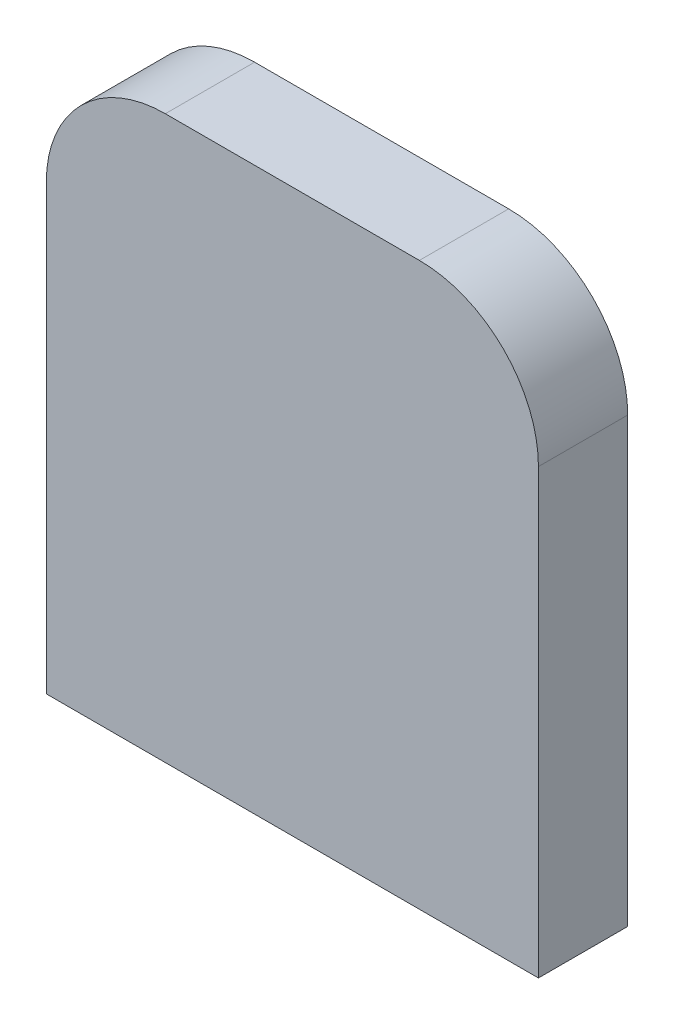
ISO-10303-21;
HEADER;
FILE_DESCRIPTION(('STEP AP214'),'2;1');
FILE_NAME('part.step','',(''),(''),'','','');
FILE_SCHEMA(('AUTOMOTIVE_DESIGN { 1 0 10303 214 1 1 1 1 }'));
ENDSEC;
DATA;
#1=APPLICATION_CONTEXT('core data for automotive mechanical design processes');
#2=APPLICATION_PROTOCOL_DEFINITION('international standard','automotive_design',2000,#1);
#3=PRODUCT_CONTEXT('',#1,'mechanical');
#4=PRODUCT('Part','Part','',(#3));
#5=PRODUCT_RELATED_PRODUCT_CATEGORY('part','',(#4));
#6=PRODUCT_DEFINITION_FORMATION('','',#4);
#7=PRODUCT_DEFINITION_CONTEXT('part definition',#1,'design');
#8=PRODUCT_DEFINITION('design','',#6,#7);
#9=PRODUCT_DEFINITION_SHAPE('','',#8);
#10=(LENGTH_UNIT() NAMED_UNIT(*) SI_UNIT(.MILLI.,.METRE.));
#11=(NAMED_UNIT(*) PLANE_ANGLE_UNIT() SI_UNIT($,.RADIAN.));
#12=(NAMED_UNIT(*) SI_UNIT($,.STERADIAN.) SOLID_ANGLE_UNIT());
#13=UNCERTAINTY_MEASURE_WITH_UNIT(LENGTH_MEASURE(1.E-05),#10,'distance_accuracy_value','');
#14=(GEOMETRIC_REPRESENTATION_CONTEXT(3) GLOBAL_UNCERTAINTY_ASSIGNED_CONTEXT((#13)) GLOBAL_UNIT_ASSIGNED_CONTEXT((#10,
#11,#12)) REPRESENTATION_CONTEXT('',''));
#15=CARTESIAN_POINT('',(0.,0.,0.));
#16=DIRECTION('',(0.,0.,1.));
#17=DIRECTION('',(1.,0.,0.));
#18=AXIS2_PLACEMENT_3D('',#15,#16,#17);
#19=CARTESIAN_POINT('',(12.5367273608581,19.7841127998877,3.));
#20=DIRECTION('',(0.,0.,-1.));
#21=DIRECTION('',(-1.,0.,0.));
#22=AXIS2_PLACEMENT_3D('',#19,#20,#21);
#23=CYLINDRICAL_SURFACE('',#22,4.);
#24=CARTESIAN_POINT('',(12.5367273608581,19.7841127998877,0.));
#25=DIRECTION('',(0.,0.,1.));
#26=DIRECTION('',(-1.,0.,0.));
#27=AXIS2_PLACEMENT_3D('',#24,#25,#26);
#28=CIRCLE('',#27,4.);
#29=CARTESIAN_POINT('',(16.5367273608581,19.7841127998877,0.));
#30=VERTEX_POINT('',#29);
#31=CARTESIAN_POINT('',(12.5367273608581,23.7841127998877,0.));
#32=VERTEX_POINT('',#31);
#33=EDGE_CURVE('E117',#30,#32,#28,.T.);
#34=ORIENTED_EDGE('',*,*,#33,.T.);
#35=DIRECTION('',(0.,0.,-1.));
#36=VECTOR('',#35,1.);
#37=CARTESIAN_POINT('',(12.5367273608581,23.7841127998877,3.));
#38=LINE('',#37,#36);
#39=CARTESIAN_POINT('',(12.5367273608581,23.7841127998877,3.));
#40=VERTEX_POINT('',#39);
#41=EDGE_CURVE('E11',#40,#32,#38,.T.);
#42=ORIENTED_EDGE('',*,*,#41,.F.);
#43=CARTESIAN_POINT('',(12.5367273608581,19.7841127998877,3.));
#44=DIRECTION('',(0.,0.,1.));
#45=DIRECTION('',(-1.,0.,0.));
#46=AXIS2_PLACEMENT_3D('',#43,#44,#45);
#47=CIRCLE('',#46,4.);
#48=CARTESIAN_POINT('',(16.5367273608581,19.7841127998877,3.));
#49=VERTEX_POINT('',#48);
#50=EDGE_CURVE('E127',#49,#40,#47,.T.);
#51=ORIENTED_EDGE('',*,*,#50,.F.);
#52=DIRECTION('',(0.,0.,-1.));
#53=VECTOR('',#52,1.);
#54=CARTESIAN_POINT('',(16.5367273608581,19.7841127998877,3.));
#55=LINE('',#54,#53);
#56=EDGE_CURVE('E113',#49,#30,#55,.T.);
#57=ORIENTED_EDGE('',*,*,#56,.T.);
#58=EDGE_LOOP('',(#34,#42,#51,#57));
#59=FACE_BOUND('',#58,.T.);
#60=ADVANCED_FACE('F33',(#59),#23,.T.);
#61=CARTESIAN_POINT('',(4.00000000000003,23.7841127998877,3.));
#62=DIRECTION('',(0.,-1.,0.));
#63=DIRECTION('',(0.,0.,-1.));
#64=AXIS2_PLACEMENT_3D('',#61,#62,#63);
#65=PLANE('',#64);
#66=DIRECTION('',(-1.,0.,0.));
#67=VECTOR('',#66,1.);
#68=CARTESIAN_POINT('',(4.00000000000003,23.7841127998877,0.));
#69=LINE('',#68,#67);
#70=CARTESIAN_POINT('',(4.00000000000003,23.7841127998877,0.));
#71=VERTEX_POINT('',#70);
#72=EDGE_CURVE('E120',#32,#71,#69,.T.);
#73=ORIENTED_EDGE('',*,*,#72,.T.);
#74=DIRECTION('',(0.,0.,-1.));
#75=VECTOR('',#74,1.);
#76=CARTESIAN_POINT('',(4.00000000000003,23.7841127998877,3.));
#77=LINE('',#76,#75);
#78=CARTESIAN_POINT('',(4.00000000000003,23.7841127998877,3.));
#79=VERTEX_POINT('',#78);
#80=EDGE_CURVE('E41',#79,#71,#77,.T.);
#81=ORIENTED_EDGE('',*,*,#80,.F.);
#82=DIRECTION('',(-1.,0.,0.));
#83=VECTOR('',#82,1.);
#84=CARTESIAN_POINT('',(4.00000000000003,23.7841127998877,3.));
#85=LINE('',#84,#83);
#86=EDGE_CURVE('E86',#40,#79,#85,.T.);
#87=ORIENTED_EDGE('',*,*,#86,.F.);
#88=ORIENTED_EDGE('',*,*,#41,.T.);
#89=EDGE_LOOP('',(#73,#81,#87,#88));
#90=FACE_BOUND('',#89,.T.);
#91=ADVANCED_FACE('F151',(#90),#65,.F.);
#92=CARTESIAN_POINT('',(4.,19.7841127998877,3.));
#93=DIRECTION('',(0.,0.,-1.));
#94=DIRECTION('',(-1.,0.,0.));
#95=AXIS2_PLACEMENT_3D('',#92,#93,#94);
#96=CYLINDRICAL_SURFACE('',#95,4.);
#97=CARTESIAN_POINT('',(4.,19.7841127998877,0.));
#98=DIRECTION('',(0.,0.,1.));
#99=DIRECTION('',(1.,0.,0.));
#100=AXIS2_PLACEMENT_3D('',#97,#98,#99);
#101=CIRCLE('',#100,4.);
#102=CARTESIAN_POINT('',(0.,19.7841127998877,0.));
#103=VERTEX_POINT('',#102);
#104=EDGE_CURVE('E122',#71,#103,#101,.T.);
#105=ORIENTED_EDGE('',*,*,#104,.T.);
#106=DIRECTION('',(0.,0.,-1.));
#107=VECTOR('',#106,1.);
#108=CARTESIAN_POINT('',(0.,19.7841127998877,3.));
#109=LINE('',#108,#107);
#110=CARTESIAN_POINT('',(0.,19.7841127998877,3.));
#111=VERTEX_POINT('',#110);
#112=EDGE_CURVE('E108',#111,#103,#109,.T.);
#113=ORIENTED_EDGE('',*,*,#112,.F.);
#114=CARTESIAN_POINT('',(4.,19.7841127998877,3.));
#115=DIRECTION('',(0.,0.,1.));
#116=DIRECTION('',(1.,0.,0.));
#117=AXIS2_PLACEMENT_3D('',#114,#115,#116);
#118=CIRCLE('',#117,4.);
#119=EDGE_CURVE('E99',#79,#111,#118,.T.);
#120=ORIENTED_EDGE('',*,*,#119,.F.);
#121=ORIENTED_EDGE('',*,*,#80,.T.);
#122=EDGE_LOOP('',(#105,#113,#120,#121));
#123=FACE_BOUND('',#122,.T.);
#124=ADVANCED_FACE('F133',(#123),#96,.T.);
#125=CARTESIAN_POINT('',(1.02348685082632E-13,4.90205487432149,3.));
#126=DIRECTION('',(1.,0.,0.));
#127=DIRECTION('',(0.,1.,0.));
#128=AXIS2_PLACEMENT_3D('',#125,#126,#127);
#129=PLANE('',#128);
#130=DIRECTION('',(0.,-1.,0.));
#131=VECTOR('',#130,1.);
#132=CARTESIAN_POINT('',(1.02348685082632E-13,4.90205487432149,0.));
#133=LINE('',#132,#131);
#134=CARTESIAN_POINT('',(1.02348685082632E-13,4.90205487432149,0.));
#135=VERTEX_POINT('',#134);
#136=EDGE_CURVE('E107',#103,#135,#133,.T.);
#137=ORIENTED_EDGE('',*,*,#136,.T.);
#138=DIRECTION('',(0.,0.,-1.));
#139=VECTOR('',#138,1.);
#140=CARTESIAN_POINT('',(1.02348685082632E-13,4.90205487432149,3.));
#141=LINE('',#140,#139);
#142=CARTESIAN_POINT('',(1.02348685082632E-13,4.90205487432149,3.));
#143=VERTEX_POINT('',#142);
#144=EDGE_CURVE('E104',#143,#135,#141,.T.);
#145=ORIENTED_EDGE('',*,*,#144,.F.);
#146=DIRECTION('',(0.,-1.,0.));
#147=VECTOR('',#146,1.);
#148=CARTESIAN_POINT('',(1.02348685082632E-13,4.90205487432149,3.));
#149=LINE('',#148,#147);
#150=EDGE_CURVE('E93',#111,#143,#149,.T.);
#151=ORIENTED_EDGE('',*,*,#150,.F.);
#152=ORIENTED_EDGE('',*,*,#112,.T.);
#153=EDGE_LOOP('',(#137,#145,#151,#152));
#154=FACE_BOUND('',#153,.T.);
#155=ADVANCED_FACE('F105',(#154),#129,.F.);
#156=CARTESIAN_POINT('',(1.02348685082632E-13,4.90205487432149,3.));
#157=DIRECTION('',(0.,1.,0.));
#158=DIRECTION('',(0.,0.,1.));
#159=AXIS2_PLACEMENT_3D('',#156,#157,#158);
#160=PLANE('',#159);
#161=DIRECTION('',(1.,0.,0.));
#162=VECTOR('',#161,1.);
#163=CARTESIAN_POINT('',(1.02348685082632E-13,4.90205487432149,0.));
#164=LINE('',#163,#162);
#165=CARTESIAN_POINT('',(16.536727360858,4.90205487432149,0.));
#166=VERTEX_POINT('',#165);
#167=EDGE_CURVE('E72',#135,#166,#164,.T.);
#168=ORIENTED_EDGE('',*,*,#167,.T.);
#169=DIRECTION('',(0.,0.,-1.));
#170=VECTOR('',#169,1.);
#171=CARTESIAN_POINT('',(16.536727360858,4.90205487432149,3.));
#172=LINE('',#171,#170);
#173=CARTESIAN_POINT('',(16.536727360858,4.90205487432149,3.));
#174=VERTEX_POINT('',#173);
#175=EDGE_CURVE('E109',#174,#166,#172,.T.);
#176=ORIENTED_EDGE('',*,*,#175,.F.);
#177=DIRECTION('',(1.,0.,0.));
#178=VECTOR('',#177,1.);
#179=CARTESIAN_POINT('',(1.02348685082632E-13,4.90205487432149,3.));
#180=LINE('',#179,#178);
#181=EDGE_CURVE('E97',#143,#174,#180,.T.);
#182=ORIENTED_EDGE('',*,*,#181,.F.);
#183=ORIENTED_EDGE('',*,*,#144,.T.);
#184=EDGE_LOOP('',(#168,#176,#182,#183));
#185=FACE_BOUND('',#184,.T.);
#186=ADVANCED_FACE('F111',(#185),#160,.F.);
#187=CARTESIAN_POINT('',(16.536727360858,4.90205487432149,3.));
#188=DIRECTION('',(-1.,0.,0.));
#189=DIRECTION('',(0.,-1.,0.));
#190=AXIS2_PLACEMENT_3D('',#187,#188,#189);
#191=PLANE('',#190);
#192=DIRECTION('',(0.,1.,0.));
#193=VECTOR('',#192,1.);
#194=CARTESIAN_POINT('',(16.536727360858,4.90205487432149,0.));
#195=LINE('',#194,#193);
#196=EDGE_CURVE('E78',#166,#30,#195,.T.);
#197=ORIENTED_EDGE('',*,*,#196,.T.);
#198=ORIENTED_EDGE('',*,*,#56,.F.);
#199=DIRECTION('',(0.,1.,0.));
#200=VECTOR('',#199,1.);
#201=CARTESIAN_POINT('',(16.536727360858,4.90205487432149,3.));
#202=LINE('',#201,#200);
#203=EDGE_CURVE('E49',#174,#49,#202,.T.);
#204=ORIENTED_EDGE('',*,*,#203,.F.);
#205=ORIENTED_EDGE('',*,*,#175,.T.);
#206=EDGE_LOOP('',(#197,#198,#204,#205));
#207=FACE_BOUND('',#206,.T.);
#208=ADVANCED_FACE('F140',(#207),#191,.F.);
#209=CARTESIAN_POINT('',(12.5367273608581,19.7841127998877,3.));
#210=DIRECTION('',(0.,0.,-1.));
#211=DIRECTION('',(-1.,0.,0.));
#212=AXIS2_PLACEMENT_3D('',#209,#210,#211);
#213=PLANE('',#212);
#214=ORIENTED_EDGE('',*,*,#50,.T.);
#215=ORIENTED_EDGE('',*,*,#86,.T.);
#216=ORIENTED_EDGE('',*,*,#119,.T.);
#217=ORIENTED_EDGE('',*,*,#150,.T.);
#218=ORIENTED_EDGE('',*,*,#181,.T.);
#219=ORIENTED_EDGE('',*,*,#203,.T.);
#220=EDGE_LOOP('',(#214,#215,#216,#217,#218,#219));
#221=FACE_BOUND('',#220,.T.);
#222=ADVANCED_FACE('F95',(#221),#213,.F.);
#223=CARTESIAN_POINT('',(12.5367273608581,19.7841127998877,0.));
#224=DIRECTION('',(0.,0.,-1.));
#225=DIRECTION('',(-1.,0.,0.));
#226=AXIS2_PLACEMENT_3D('',#223,#224,#225);
#227=PLANE('',#226);
#228=ORIENTED_EDGE('',*,*,#33,.F.);
#229=ORIENTED_EDGE('',*,*,#196,.F.);
#230=ORIENTED_EDGE('',*,*,#167,.F.);
#231=ORIENTED_EDGE('',*,*,#136,.F.);
#232=ORIENTED_EDGE('',*,*,#104,.F.);
#233=ORIENTED_EDGE('',*,*,#72,.F.);
#234=EDGE_LOOP('',(#228,#229,#230,#231,#232,#233));
#235=FACE_BOUND('',#234,.T.);
#236=ADVANCED_FACE('F136',(#235),#227,.T.);
#237=CLOSED_SHELL('',(#60,#91,#124,#155,#186,#208,#222,#236));
#238=MANIFOLD_SOLID_BREP('B2',#237);
#239=ADVANCED_BREP_SHAPE_REPRESENTATION('',(#18,#238),#14);
#240=SHAPE_DEFINITION_REPRESENTATION(#9,#239);
ENDSEC;
END-ISO-10303-21;
